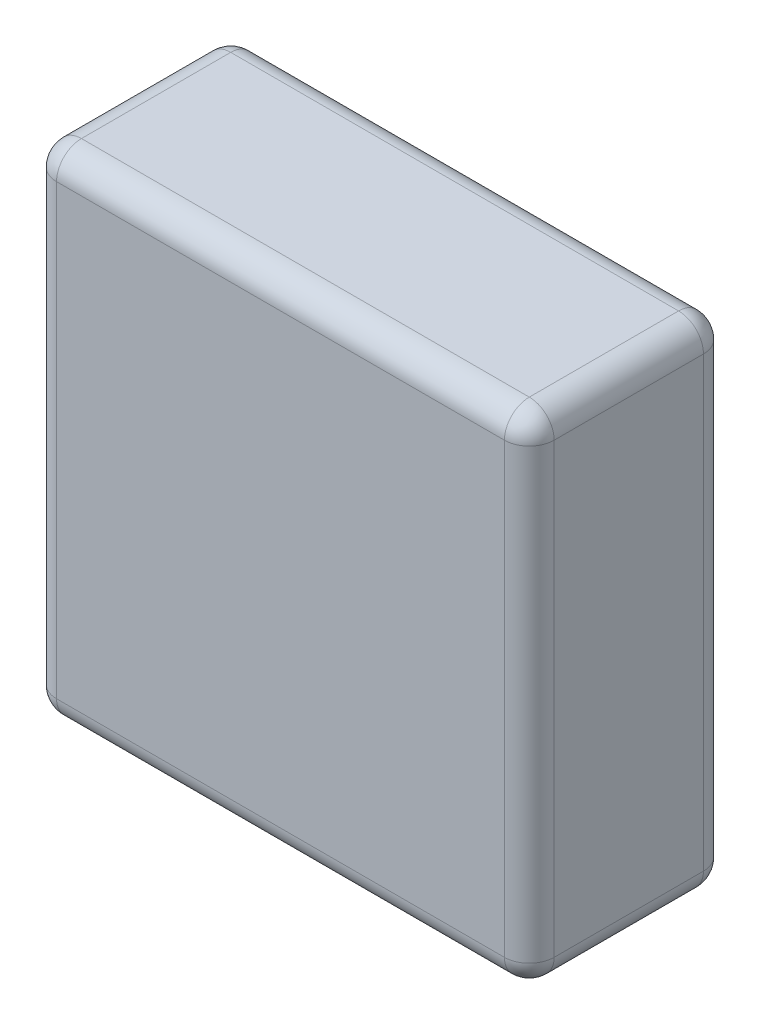
ISO-10303-21;
HEADER;
FILE_DESCRIPTION(('STEP AP214'),'2;1');
FILE_NAME('part.step','',(''),(''),'','','');
FILE_SCHEMA(('AUTOMOTIVE_DESIGN { 1 0 10303 214 1 1 1 1 }'));
ENDSEC;
DATA;
#1=APPLICATION_CONTEXT('core data for automotive mechanical design processes');
#2=APPLICATION_PROTOCOL_DEFINITION('international standard','automotive_design',2000,#1);
#3=PRODUCT_CONTEXT('',#1,'mechanical');
#4=PRODUCT('Part','Part','',(#3));
#5=PRODUCT_RELATED_PRODUCT_CATEGORY('part','',(#4));
#6=PRODUCT_DEFINITION_FORMATION('','',#4);
#7=PRODUCT_DEFINITION_CONTEXT('part definition',#1,'design');
#8=PRODUCT_DEFINITION('design','',#6,#7);
#9=PRODUCT_DEFINITION_SHAPE('','',#8);
#10=(LENGTH_UNIT() NAMED_UNIT(*) SI_UNIT(.MILLI.,.METRE.));
#11=(NAMED_UNIT(*) PLANE_ANGLE_UNIT() SI_UNIT($,.RADIAN.));
#12=(NAMED_UNIT(*) SI_UNIT($,.STERADIAN.) SOLID_ANGLE_UNIT());
#13=UNCERTAINTY_MEASURE_WITH_UNIT(LENGTH_MEASURE(1.E-05),#10,'distance_accuracy_value','');
#14=(GEOMETRIC_REPRESENTATION_CONTEXT(3) GLOBAL_UNCERTAINTY_ASSIGNED_CONTEXT((#13)) GLOBAL_UNIT_ASSIGNED_CONTEXT((#10,
#11,#12)) REPRESENTATION_CONTEXT('',''));
#15=CARTESIAN_POINT('',(0.,0.,0.));
#16=DIRECTION('',(0.,0.,1.));
#17=DIRECTION('',(1.,0.,0.));
#18=AXIS2_PLACEMENT_3D('',#15,#16,#17);
#19=CARTESIAN_POINT('',(0.,0.,4.));
#20=DIRECTION('',(1.,0.,0.));
#21=DIRECTION('',(0.,1.,0.));
#22=AXIS2_PLACEMENT_3D('',#19,#20,#21);
#23=PLANE('',#22);
#24=DIRECTION('',(0.,0.,-1.));
#25=VECTOR('',#24,1.);
#26=CARTESIAN_POINT('',(0.,-0.5,4.));
#27=LINE('',#26,#25);
#28=CARTESIAN_POINT('',(0.,-0.5,3.5));
#29=VERTEX_POINT('',#28);
#30=CARTESIAN_POINT('',(0.,-0.5,0.5));
#31=VERTEX_POINT('',#30);
#32=EDGE_CURVE('E131',#29,#31,#27,.T.);
#33=ORIENTED_EDGE('',*,*,#32,.T.);
#34=DIRECTION('',(0.,-1.,0.));
#35=VECTOR('',#34,1.);
#36=CARTESIAN_POINT('',(0.,0.,0.5));
#37=LINE('',#36,#35);
#38=CARTESIAN_POINT('',(0.,-9.5,0.5));
#39=VERTEX_POINT('',#38);
#40=EDGE_CURVE('E127',#31,#39,#37,.T.);
#41=ORIENTED_EDGE('',*,*,#40,.T.);
#42=DIRECTION('',(0.,0.,-1.));
#43=VECTOR('',#42,1.);
#44=CARTESIAN_POINT('',(0.,-9.5,4.));
#45=LINE('',#44,#43);
#46=CARTESIAN_POINT('',(0.,-9.5,3.5));
#47=VERTEX_POINT('',#46);
#48=EDGE_CURVE('E120',#39,#47,#45,.F.);
#49=ORIENTED_EDGE('',*,*,#48,.T.);
#50=DIRECTION('',(0.,-1.,0.));
#51=VECTOR('',#50,1.);
#52=CARTESIAN_POINT('',(0.,0.,3.5));
#53=LINE('',#52,#51);
#54=EDGE_CURVE('E124',#47,#29,#53,.F.);
#55=ORIENTED_EDGE('',*,*,#54,.T.);
#56=EDGE_LOOP('',(#33,#41,#49,#55));
#57=FACE_BOUND('',#56,.T.);
#58=ADVANCED_FACE('F32',(#57),#23,.F.);
#59=CARTESIAN_POINT('',(0.,-10.,4.));
#60=DIRECTION('',(0.,1.,0.));
#61=DIRECTION('',(0.,0.,1.));
#62=AXIS2_PLACEMENT_3D('',#59,#60,#61);
#63=PLANE('',#62);
#64=DIRECTION('',(0.,0.,-1.));
#65=VECTOR('',#64,1.);
#66=CARTESIAN_POINT('',(0.500000000000001,-10.,4.));
#67=LINE('',#66,#65);
#68=CARTESIAN_POINT('',(0.500000000000001,-10.,3.5));
#69=VERTEX_POINT('',#68);
#70=CARTESIAN_POINT('',(0.500000000000001,-10.,0.5));
#71=VERTEX_POINT('',#70);
#72=EDGE_CURVE('E139',#69,#71,#67,.T.);
#73=ORIENTED_EDGE('',*,*,#72,.T.);
#74=DIRECTION('',(1.,0.,0.));
#75=VECTOR('',#74,1.);
#76=CARTESIAN_POINT('',(0.,-10.,0.5));
#77=LINE('',#76,#75);
#78=CARTESIAN_POINT('',(9.5,-10.,0.5));
#79=VERTEX_POINT('',#78);
#80=EDGE_CURVE('E177',#71,#79,#77,.T.);
#81=ORIENTED_EDGE('',*,*,#80,.T.);
#82=DIRECTION('',(0.,0.,-1.));
#83=VECTOR('',#82,1.);
#84=CARTESIAN_POINT('',(9.5,-10.,4.));
#85=LINE('',#84,#83);
#86=CARTESIAN_POINT('',(9.5,-10.,3.5));
#87=VERTEX_POINT('',#86);
#88=EDGE_CURVE('E174',#79,#87,#85,.F.);
#89=ORIENTED_EDGE('',*,*,#88,.T.);
#90=DIRECTION('',(1.,0.,0.));
#91=VECTOR('',#90,1.);
#92=CARTESIAN_POINT('',(0.,-10.,3.5));
#93=LINE('',#92,#91);
#94=EDGE_CURVE('E172',#87,#69,#93,.F.);
#95=ORIENTED_EDGE('',*,*,#94,.T.);
#96=EDGE_LOOP('',(#73,#81,#89,#95));
#97=FACE_BOUND('',#96,.T.);
#98=ADVANCED_FACE('F294',(#97),#63,.F.);
#99=CARTESIAN_POINT('',(10.,0.,4.));
#100=DIRECTION('',(-1.,0.,0.));
#101=DIRECTION('',(0.,-1.,0.));
#102=AXIS2_PLACEMENT_3D('',#99,#100,#101);
#103=PLANE('',#102);
#104=DIRECTION('',(0.,0.,-1.));
#105=VECTOR('',#104,1.);
#106=CARTESIAN_POINT('',(10.,-9.5,4.));
#107=LINE('',#106,#105);
#108=CARTESIAN_POINT('',(10.,-9.5,3.5));
#109=VERTEX_POINT('',#108);
#110=CARTESIAN_POINT('',(10.,-9.5,0.5));
#111=VERTEX_POINT('',#110);
#112=EDGE_CURVE('E183',#109,#111,#107,.T.);
#113=ORIENTED_EDGE('',*,*,#112,.T.);
#114=DIRECTION('',(0.,1.,0.));
#115=VECTOR('',#114,1.);
#116=CARTESIAN_POINT('',(10.,0.,0.5));
#117=LINE('',#116,#115);
#118=CARTESIAN_POINT('',(10.,-0.5,0.5));
#119=VERTEX_POINT('',#118);
#120=EDGE_CURVE('E186',#111,#119,#117,.T.);
#121=ORIENTED_EDGE('',*,*,#120,.T.);
#122=DIRECTION('',(0.,0.,-1.));
#123=VECTOR('',#122,1.);
#124=CARTESIAN_POINT('',(10.,-0.5,4.));
#125=LINE('',#124,#123);
#126=CARTESIAN_POINT('',(10.,-0.5,3.5));
#127=VERTEX_POINT('',#126);
#128=EDGE_CURVE('E181',#119,#127,#125,.F.);
#129=ORIENTED_EDGE('',*,*,#128,.T.);
#130=DIRECTION('',(0.,1.,0.));
#131=VECTOR('',#130,1.);
#132=CARTESIAN_POINT('',(10.,-10.,3.5));
#133=LINE('',#132,#131);
#134=EDGE_CURVE('E179',#127,#109,#133,.F.);
#135=ORIENTED_EDGE('',*,*,#134,.T.);
#136=EDGE_LOOP('',(#113,#121,#129,#135));
#137=FACE_BOUND('',#136,.T.);
#138=ADVANCED_FACE('F271',(#137),#103,.F.);
#139=CARTESIAN_POINT('',(0.,0.,4.));
#140=DIRECTION('',(0.,-1.,0.));
#141=DIRECTION('',(0.,0.,-1.));
#142=AXIS2_PLACEMENT_3D('',#139,#140,#141);
#143=PLANE('',#142);
#144=DIRECTION('',(0.,0.,-1.));
#145=VECTOR('',#144,1.);
#146=CARTESIAN_POINT('',(9.5,0.,4.));
#147=LINE('',#146,#145);
#148=CARTESIAN_POINT('',(9.5,0.,3.5));
#149=VERTEX_POINT('',#148);
#150=CARTESIAN_POINT('',(9.5,0.,0.5));
#151=VERTEX_POINT('',#150);
#152=EDGE_CURVE('E165',#149,#151,#147,.T.);
#153=ORIENTED_EDGE('',*,*,#152,.T.);
#154=DIRECTION('',(-1.,0.,0.));
#155=VECTOR('',#154,1.);
#156=CARTESIAN_POINT('',(0.,0.,0.5));
#157=LINE('',#156,#155);
#158=CARTESIAN_POINT('',(0.5,0.,0.5));
#159=VERTEX_POINT('',#158);
#160=EDGE_CURVE('E170',#151,#159,#157,.T.);
#161=ORIENTED_EDGE('',*,*,#160,.T.);
#162=DIRECTION('',(0.,0.,-1.));
#163=VECTOR('',#162,1.);
#164=CARTESIAN_POINT('',(0.5,0.,4.));
#165=LINE('',#164,#163);
#166=CARTESIAN_POINT('',(0.5,0.,3.5));
#167=VERTEX_POINT('',#166);
#168=EDGE_CURVE('E167',#159,#167,#165,.F.);
#169=ORIENTED_EDGE('',*,*,#168,.T.);
#170=DIRECTION('',(-1.,0.,0.));
#171=VECTOR('',#170,1.);
#172=CARTESIAN_POINT('',(10.,0.,3.5));
#173=LINE('',#172,#171);
#174=EDGE_CURVE('E163',#167,#149,#173,.F.);
#175=ORIENTED_EDGE('',*,*,#174,.T.);
#176=EDGE_LOOP('',(#153,#161,#169,#175));
#177=FACE_BOUND('',#176,.T.);
#178=ADVANCED_FACE('F301',(#177),#143,.F.);
#179=CARTESIAN_POINT('',(0.,0.,4.));
#180=DIRECTION('',(0.,0.,1.));
#181=DIRECTION('',(1.,0.,0.));
#182=AXIS2_PLACEMENT_3D('',#179,#180,#181);
#183=PLANE('',#182);
#184=DIRECTION('',(0.,1.,0.));
#185=VECTOR('',#184,1.);
#186=CARTESIAN_POINT('',(9.5,0.,4.));
#187=LINE('',#186,#185);
#188=CARTESIAN_POINT('',(9.5,-9.5,4.));
#189=VERTEX_POINT('',#188);
#190=CARTESIAN_POINT('',(9.5,-0.5,4.));
#191=VERTEX_POINT('',#190);
#192=EDGE_CURVE('E41',#189,#191,#187,.T.);
#193=ORIENTED_EDGE('',*,*,#192,.T.);
#194=DIRECTION('',(-1.,0.,0.));
#195=VECTOR('',#194,1.);
#196=CARTESIAN_POINT('',(0.,-0.5,4.));
#197=LINE('',#196,#195);
#198=CARTESIAN_POINT('',(0.5,-0.5,4.));
#199=VERTEX_POINT('',#198);
#200=EDGE_CURVE('E11',#191,#199,#197,.T.);
#201=ORIENTED_EDGE('',*,*,#200,.T.);
#202=DIRECTION('',(0.,-1.,0.));
#203=VECTOR('',#202,1.);
#204=CARTESIAN_POINT('',(0.500000000000001,-10.,4.));
#205=LINE('',#204,#203);
#206=CARTESIAN_POINT('',(0.500000000000001,-9.5,4.));
#207=VERTEX_POINT('',#206);
#208=EDGE_CURVE('E197',#199,#207,#205,.T.);
#209=ORIENTED_EDGE('',*,*,#208,.T.);
#210=DIRECTION('',(1.,0.,0.));
#211=VECTOR('',#210,1.);
#212=CARTESIAN_POINT('',(10.,-9.5,4.));
#213=LINE('',#212,#211);
#214=EDGE_CURVE('E52',#207,#189,#213,.T.);
#215=ORIENTED_EDGE('',*,*,#214,.T.);
#216=EDGE_LOOP('',(#193,#201,#209,#215));
#217=FACE_BOUND('',#216,.T.);
#218=ADVANCED_FACE('F364',(#217),#183,.T.);
#219=CARTESIAN_POINT('',(0.,0.,0.));
#220=DIRECTION('',(0.,0.,1.));
#221=DIRECTION('',(1.,0.,0.));
#222=AXIS2_PLACEMENT_3D('',#219,#220,#221);
#223=PLANE('',#222);
#224=DIRECTION('',(0.,1.,0.));
#225=VECTOR('',#224,1.);
#226=CARTESIAN_POINT('',(9.5,0.,0.));
#227=LINE('',#226,#225);
#228=CARTESIAN_POINT('',(9.5,-0.5,0.));
#229=VERTEX_POINT('',#228);
#230=CARTESIAN_POINT('',(9.5,-9.5,0.));
#231=VERTEX_POINT('',#230);
#232=EDGE_CURVE('E192',#229,#231,#227,.F.);
#233=ORIENTED_EDGE('',*,*,#232,.T.);
#234=DIRECTION('',(1.,0.,0.));
#235=VECTOR('',#234,1.);
#236=CARTESIAN_POINT('',(0.,-9.5,0.));
#237=LINE('',#236,#235);
#238=CARTESIAN_POINT('',(0.500000000000001,-9.5,0.));
#239=VERTEX_POINT('',#238);
#240=EDGE_CURVE('E194',#231,#239,#237,.F.);
#241=ORIENTED_EDGE('',*,*,#240,.T.);
#242=DIRECTION('',(0.,-1.,0.));
#243=VECTOR('',#242,1.);
#244=CARTESIAN_POINT('',(0.5,0.,0.));
#245=LINE('',#244,#243);
#246=CARTESIAN_POINT('',(0.5,-0.5,0.));
#247=VERTEX_POINT('',#246);
#248=EDGE_CURVE('E188',#239,#247,#245,.F.);
#249=ORIENTED_EDGE('',*,*,#248,.T.);
#250=DIRECTION('',(-1.,0.,0.));
#251=VECTOR('',#250,1.);
#252=CARTESIAN_POINT('',(0.,-0.5,0.));
#253=LINE('',#252,#251);
#254=EDGE_CURVE('E190',#247,#229,#253,.F.);
#255=ORIENTED_EDGE('',*,*,#254,.T.);
#256=EDGE_LOOP('',(#233,#241,#249,#255));
#257=FACE_BOUND('',#256,.T.);
#258=ADVANCED_FACE('F263',(#257),#223,.F.);
#259=CARTESIAN_POINT('',(9.5,-9.5,4.));
#260=DIRECTION('',(0.,0.,-1.));
#261=DIRECTION('',(-1.,0.,0.));
#262=AXIS2_PLACEMENT_3D('',#259,#260,#261);
#263=CYLINDRICAL_SURFACE('',#262,0.5);
#264=CARTESIAN_POINT('',(9.5,-9.5,3.5));
#265=DIRECTION('',(0.,0.,1.));
#266=DIRECTION('',(1.,0.,0.));
#267=AXIS2_PLACEMENT_3D('',#264,#265,#266);
#268=CIRCLE('',#267,0.5);
#269=EDGE_CURVE('E36',#87,#109,#268,.T.);
#270=ORIENTED_EDGE('',*,*,#269,.F.);
#271=ORIENTED_EDGE('',*,*,#88,.F.);
#272=CARTESIAN_POINT('',(9.5,-9.5,0.5));
#273=DIRECTION('',(0.,0.,-1.));
#274=DIRECTION('',(-1.,0.,0.));
#275=AXIS2_PLACEMENT_3D('',#272,#273,#274);
#276=CIRCLE('',#275,0.5);
#277=EDGE_CURVE('E159',#111,#79,#276,.T.);
#278=ORIENTED_EDGE('',*,*,#277,.F.);
#279=ORIENTED_EDGE('',*,*,#112,.F.);
#280=EDGE_LOOP('',(#270,#271,#278,#279));
#281=FACE_BOUND('',#280,.T.);
#282=ADVANCED_FACE('F34',(#281),#263,.T.);
#283=CARTESIAN_POINT('',(9.5,-9.5,3.5));
#284=DIRECTION('',(0.,0.,1.));
#285=DIRECTION('',(1.,0.,0.));
#286=AXIS2_PLACEMENT_3D('',#283,#284,#285);
#287=SPHERICAL_SURFACE('',#286,0.5);
#288=CARTESIAN_POINT('',(9.5,-9.5,3.5));
#289=DIRECTION('',(1.,0.,0.));
#290=DIRECTION('',(0.,0.,-1.));
#291=AXIS2_PLACEMENT_3D('',#288,#289,#290);
#292=CIRCLE('',#291,0.5);
#293=EDGE_CURVE('E244',#87,#189,#292,.F.);
#294=ORIENTED_EDGE('',*,*,#293,.F.);
#295=ORIENTED_EDGE('',*,*,#269,.T.);
#296=CARTESIAN_POINT('',(9.5,-9.5,3.5));
#297=DIRECTION('',(0.,-1.,0.));
#298=DIRECTION('',(0.,0.,-1.));
#299=AXIS2_PLACEMENT_3D('',#296,#297,#298);
#300=CIRCLE('',#299,0.5);
#301=EDGE_CURVE('E246',#189,#109,#300,.F.);
#302=ORIENTED_EDGE('',*,*,#301,.F.);
#303=EDGE_LOOP('',(#294,#295,#302));
#304=FACE_BOUND('',#303,.T.);
#305=ADVANCED_FACE('F289',(#304),#287,.T.);
#306=CARTESIAN_POINT('',(9.5,-9.5,0.5));
#307=DIRECTION('',(0.,0.,1.));
#308=DIRECTION('',(1.,0.,0.));
#309=AXIS2_PLACEMENT_3D('',#306,#307,#308);
#310=SPHERICAL_SURFACE('',#309,0.5);
#311=CARTESIAN_POINT('',(9.5,-9.5,0.5));
#312=DIRECTION('',(0.,-1.,0.));
#313=DIRECTION('',(0.,0.,-1.));
#314=AXIS2_PLACEMENT_3D('',#311,#312,#313);
#315=CIRCLE('',#314,0.5);
#316=EDGE_CURVE('E238',#111,#231,#315,.F.);
#317=ORIENTED_EDGE('',*,*,#316,.F.);
#318=ORIENTED_EDGE('',*,*,#277,.T.);
#319=CARTESIAN_POINT('',(9.5,-9.5,0.5));
#320=DIRECTION('',(1.,0.,0.));
#321=DIRECTION('',(0.,0.,-1.));
#322=AXIS2_PLACEMENT_3D('',#319,#320,#321);
#323=CIRCLE('',#322,0.5);
#324=EDGE_CURVE('E241',#231,#79,#323,.F.);
#325=ORIENTED_EDGE('',*,*,#324,.F.);
#326=EDGE_LOOP('',(#317,#318,#325));
#327=FACE_BOUND('',#326,.T.);
#328=ADVANCED_FACE('F253',(#327),#310,.T.);
#329=CARTESIAN_POINT('',(9.5,0.,3.5));
#330=DIRECTION('',(0.,-1.,0.));
#331=DIRECTION('',(1.,0.,0.));
#332=AXIS2_PLACEMENT_3D('',#329,#330,#331);
#333=CYLINDRICAL_SURFACE('',#332,0.5);
#334=ORIENTED_EDGE('',*,*,#301,.T.);
#335=ORIENTED_EDGE('',*,*,#134,.F.);
#336=CARTESIAN_POINT('',(9.5,-0.5,3.5));
#337=DIRECTION('',(0.,1.,0.));
#338=DIRECTION('',(-1.,0.,0.));
#339=AXIS2_PLACEMENT_3D('',#336,#337,#338);
#340=CIRCLE('',#339,0.5);
#341=EDGE_CURVE('E232',#191,#127,#340,.T.);
#342=ORIENTED_EDGE('',*,*,#341,.F.);
#343=ORIENTED_EDGE('',*,*,#192,.F.);
#344=EDGE_LOOP('',(#334,#335,#342,#343));
#345=FACE_BOUND('',#344,.T.);
#346=ADVANCED_FACE('F284',(#345),#333,.T.);
#347=CARTESIAN_POINT('',(0.,-9.5,3.5));
#348=DIRECTION('',(-1.,0.,0.));
#349=DIRECTION('',(0.,0.,1.));
#350=AXIS2_PLACEMENT_3D('',#347,#348,#349);
#351=CYLINDRICAL_SURFACE('',#350,0.5);
#352=ORIENTED_EDGE('',*,*,#293,.T.);
#353=ORIENTED_EDGE('',*,*,#214,.F.);
#354=CARTESIAN_POINT('',(0.500000000000001,-9.5,3.5));
#355=DIRECTION('',(-1.,0.,0.));
#356=DIRECTION('',(0.,0.,1.));
#357=AXIS2_PLACEMENT_3D('',#354,#355,#356);
#358=CIRCLE('',#357,0.5);
#359=EDGE_CURVE('E143',#69,#207,#358,.T.);
#360=ORIENTED_EDGE('',*,*,#359,.F.);
#361=ORIENTED_EDGE('',*,*,#94,.F.);
#362=EDGE_LOOP('',(#352,#353,#360,#361));
#363=FACE_BOUND('',#362,.T.);
#364=ADVANCED_FACE('F292',(#363),#351,.T.);
#365=CARTESIAN_POINT('',(0.500000000000001,-9.5,4.));
#366=DIRECTION('',(0.,0.,-1.));
#367=DIRECTION('',(-1.,0.,0.));
#368=AXIS2_PLACEMENT_3D('',#365,#366,#367);
#369=CYLINDRICAL_SURFACE('',#368,0.5);
#370=CARTESIAN_POINT('',(0.500000000000001,-9.5,0.5));
#371=DIRECTION('',(0.,0.,-1.));
#372=DIRECTION('',(-1.,0.,0.));
#373=AXIS2_PLACEMENT_3D('',#370,#371,#372);
#374=CIRCLE('',#373,0.5);
#375=EDGE_CURVE('E144',#71,#39,#374,.T.);
#376=ORIENTED_EDGE('',*,*,#375,.F.);
#377=ORIENTED_EDGE('',*,*,#72,.F.);
#378=CARTESIAN_POINT('',(0.500000000000001,-9.5,3.5));
#379=DIRECTION('',(0.,0.,1.));
#380=DIRECTION('',(1.,0.,0.));
#381=AXIS2_PLACEMENT_3D('',#378,#379,#380);
#382=CIRCLE('',#381,0.5);
#383=EDGE_CURVE('E135',#47,#69,#382,.T.);
#384=ORIENTED_EDGE('',*,*,#383,.F.);
#385=ORIENTED_EDGE('',*,*,#48,.F.);
#386=EDGE_LOOP('',(#376,#377,#384,#385));
#387=FACE_BOUND('',#386,.T.);
#388=ADVANCED_FACE('F137',(#387),#369,.T.);
#389=CARTESIAN_POINT('',(0.,-9.5,0.5));
#390=DIRECTION('',(1.,0.,0.));
#391=DIRECTION('',(0.,0.,-1.));
#392=AXIS2_PLACEMENT_3D('',#389,#390,#391);
#393=CYLINDRICAL_SURFACE('',#392,0.5);
#394=ORIENTED_EDGE('',*,*,#324,.T.);
#395=ORIENTED_EDGE('',*,*,#80,.F.);
#396=CARTESIAN_POINT('',(0.500000000000001,-9.5,0.5));
#397=DIRECTION('',(-1.,0.,0.));
#398=DIRECTION('',(0.,0.,1.));
#399=AXIS2_PLACEMENT_3D('',#396,#397,#398);
#400=CIRCLE('',#399,0.5);
#401=EDGE_CURVE('E228',#239,#71,#400,.T.);
#402=ORIENTED_EDGE('',*,*,#401,.F.);
#403=ORIENTED_EDGE('',*,*,#240,.F.);
#404=EDGE_LOOP('',(#394,#395,#402,#403));
#405=FACE_BOUND('',#404,.T.);
#406=ADVANCED_FACE('F260',(#405),#393,.T.);
#407=CARTESIAN_POINT('',(9.5,0.,0.5));
#408=DIRECTION('',(0.,1.,0.));
#409=DIRECTION('',(-1.,0.,0.));
#410=AXIS2_PLACEMENT_3D('',#407,#408,#409);
#411=CYLINDRICAL_SURFACE('',#410,0.5);
#412=ORIENTED_EDGE('',*,*,#316,.T.);
#413=ORIENTED_EDGE('',*,*,#232,.F.);
#414=CARTESIAN_POINT('',(9.5,-0.5,0.5));
#415=DIRECTION('',(0.,1.,0.));
#416=DIRECTION('',(-1.,0.,0.));
#417=AXIS2_PLACEMENT_3D('',#414,#415,#416);
#418=CIRCLE('',#417,0.5);
#419=EDGE_CURVE('E225',#119,#229,#418,.T.);
#420=ORIENTED_EDGE('',*,*,#419,.F.);
#421=ORIENTED_EDGE('',*,*,#120,.F.);
#422=EDGE_LOOP('',(#412,#413,#420,#421));
#423=FACE_BOUND('',#422,.T.);
#424=ADVANCED_FACE('F268',(#423),#411,.T.);
#425=CARTESIAN_POINT('',(9.5,-0.5,4.));
#426=DIRECTION('',(0.,0.,-1.));
#427=DIRECTION('',(-1.,0.,0.));
#428=AXIS2_PLACEMENT_3D('',#425,#426,#427);
#429=CYLINDRICAL_SURFACE('',#428,0.5);
#430=CARTESIAN_POINT('',(9.5,-0.5,3.5));
#431=DIRECTION('',(0.,0.,1.));
#432=DIRECTION('',(1.,0.,0.));
#433=AXIS2_PLACEMENT_3D('',#430,#431,#432);
#434=CIRCLE('',#433,0.5);
#435=EDGE_CURVE('E235',#127,#149,#434,.T.);
#436=ORIENTED_EDGE('',*,*,#435,.F.);
#437=ORIENTED_EDGE('',*,*,#128,.F.);
#438=CARTESIAN_POINT('',(9.5,-0.5,0.5));
#439=DIRECTION('',(0.,0.,-1.));
#440=DIRECTION('',(-1.,0.,0.));
#441=AXIS2_PLACEMENT_3D('',#438,#439,#440);
#442=CIRCLE('',#441,0.5);
#443=EDGE_CURVE('E222',#151,#119,#442,.T.);
#444=ORIENTED_EDGE('',*,*,#443,.F.);
#445=ORIENTED_EDGE('',*,*,#152,.F.);
#446=EDGE_LOOP('',(#436,#437,#444,#445));
#447=FACE_BOUND('',#446,.T.);
#448=ADVANCED_FACE('F276',(#447),#429,.T.);
#449=CARTESIAN_POINT('',(9.5,-0.5,3.5));
#450=DIRECTION('',(0.,0.,1.));
#451=DIRECTION('',(1.,0.,0.));
#452=AXIS2_PLACEMENT_3D('',#449,#450,#451);
#453=SPHERICAL_SURFACE('',#452,0.5);
#454=ORIENTED_EDGE('',*,*,#341,.T.);
#455=ORIENTED_EDGE('',*,*,#435,.T.);
#456=CARTESIAN_POINT('',(9.5,-0.5,3.5));
#457=DIRECTION('',(1.,0.,0.));
#458=DIRECTION('',(0.,0.,-1.));
#459=AXIS2_PLACEMENT_3D('',#456,#457,#458);
#460=CIRCLE('',#459,0.5);
#461=EDGE_CURVE('E151',#191,#149,#460,.F.);
#462=ORIENTED_EDGE('',*,*,#461,.F.);
#463=EDGE_LOOP('',(#454,#455,#462));
#464=FACE_BOUND('',#463,.T.);
#465=ADVANCED_FACE('F281',(#464),#453,.T.);
#466=CARTESIAN_POINT('',(0.500000000000001,-9.5,3.5));
#467=DIRECTION('',(0.,0.,1.));
#468=DIRECTION('',(1.,0.,0.));
#469=AXIS2_PLACEMENT_3D('',#466,#467,#468);
#470=SPHERICAL_SURFACE('',#469,0.5);
#471=ORIENTED_EDGE('',*,*,#383,.T.);
#472=ORIENTED_EDGE('',*,*,#359,.T.);
#473=CARTESIAN_POINT('',(0.500000000000001,-9.5,3.5));
#474=DIRECTION('',(0.,-1.,0.));
#475=DIRECTION('',(0.,0.,-1.));
#476=AXIS2_PLACEMENT_3D('',#473,#474,#475);
#477=CIRCLE('',#476,0.5);
#478=EDGE_CURVE('E147',#47,#207,#477,.F.);
#479=ORIENTED_EDGE('',*,*,#478,.F.);
#480=EDGE_LOOP('',(#471,#472,#479));
#481=FACE_BOUND('',#480,.T.);
#482=ADVANCED_FACE('F148',(#481),#470,.T.);
#483=CARTESIAN_POINT('',(0.500000000000001,-9.5,0.5));
#484=DIRECTION('',(0.,0.,1.));
#485=DIRECTION('',(1.,0.,0.));
#486=AXIS2_PLACEMENT_3D('',#483,#484,#485);
#487=SPHERICAL_SURFACE('',#486,0.5);
#488=ORIENTED_EDGE('',*,*,#401,.T.);
#489=ORIENTED_EDGE('',*,*,#375,.T.);
#490=CARTESIAN_POINT('',(0.500000000000001,-9.5,0.5));
#491=DIRECTION('',(0.,-1.,0.));
#492=DIRECTION('',(0.,0.,-1.));
#493=AXIS2_PLACEMENT_3D('',#490,#491,#492);
#494=CIRCLE('',#493,0.5);
#495=EDGE_CURVE('E152',#239,#39,#494,.F.);
#496=ORIENTED_EDGE('',*,*,#495,.F.);
#497=EDGE_LOOP('',(#488,#489,#496));
#498=FACE_BOUND('',#497,.T.);
#499=ADVANCED_FACE('F335',(#498),#487,.T.);
#500=CARTESIAN_POINT('',(9.5,-0.5,0.5));
#501=DIRECTION('',(0.,0.,1.));
#502=DIRECTION('',(1.,0.,0.));
#503=AXIS2_PLACEMENT_3D('',#500,#501,#502);
#504=SPHERICAL_SURFACE('',#503,0.5);
#505=ORIENTED_EDGE('',*,*,#443,.T.);
#506=ORIENTED_EDGE('',*,*,#419,.T.);
#507=CARTESIAN_POINT('',(9.5,-0.5,0.5));
#508=DIRECTION('',(1.,0.,0.));
#509=DIRECTION('',(0.,0.,-1.));
#510=AXIS2_PLACEMENT_3D('',#507,#508,#509);
#511=CIRCLE('',#510,0.5);
#512=EDGE_CURVE('E215',#151,#229,#511,.F.);
#513=ORIENTED_EDGE('',*,*,#512,.F.);
#514=EDGE_LOOP('',(#505,#506,#513));
#515=FACE_BOUND('',#514,.T.);
#516=ADVANCED_FACE('F331',(#515),#504,.T.);
#517=CARTESIAN_POINT('',(0.,-0.5,3.5));
#518=DIRECTION('',(1.,0.,0.));
#519=DIRECTION('',(0.,0.,-1.));
#520=AXIS2_PLACEMENT_3D('',#517,#518,#519);
#521=CYLINDRICAL_SURFACE('',#520,0.5);
#522=ORIENTED_EDGE('',*,*,#461,.T.);
#523=ORIENTED_EDGE('',*,*,#174,.F.);
#524=CARTESIAN_POINT('',(0.5,-0.5,3.5));
#525=DIRECTION('',(-1.,0.,0.));
#526=DIRECTION('',(0.,-1.,0.));
#527=AXIS2_PLACEMENT_3D('',#524,#525,#526);
#528=CIRCLE('',#527,0.5);
#529=EDGE_CURVE('E212',#199,#167,#528,.T.);
#530=ORIENTED_EDGE('',*,*,#529,.F.);
#531=ORIENTED_EDGE('',*,*,#200,.F.);
#532=EDGE_LOOP('',(#522,#523,#530,#531));
#533=FACE_BOUND('',#532,.T.);
#534=ADVANCED_FACE('F328',(#533),#521,.T.);
#535=CARTESIAN_POINT('',(0.5,0.,3.5));
#536=DIRECTION('',(0.,1.,0.));
#537=DIRECTION('',(-1.,0.,0.));
#538=AXIS2_PLACEMENT_3D('',#535,#536,#537);
#539=CYLINDRICAL_SURFACE('',#538,0.5);
#540=ORIENTED_EDGE('',*,*,#478,.T.);
#541=ORIENTED_EDGE('',*,*,#208,.F.);
#542=CARTESIAN_POINT('',(0.5,-0.5,3.5));
#543=DIRECTION('',(0.,1.,0.));
#544=DIRECTION('',(-1.,0.,0.));
#545=AXIS2_PLACEMENT_3D('',#542,#543,#544);
#546=CIRCLE('',#545,0.5);
#547=EDGE_CURVE('E155',#29,#199,#546,.T.);
#548=ORIENTED_EDGE('',*,*,#547,.F.);
#549=ORIENTED_EDGE('',*,*,#54,.F.);
#550=EDGE_LOOP('',(#540,#541,#548,#549));
#551=FACE_BOUND('',#550,.T.);
#552=ADVANCED_FACE('F154',(#551),#539,.T.);
#553=CARTESIAN_POINT('',(0.5,0.,0.5));
#554=DIRECTION('',(0.,-1.,0.));
#555=DIRECTION('',(1.,0.,0.));
#556=AXIS2_PLACEMENT_3D('',#553,#554,#555);
#557=CYLINDRICAL_SURFACE('',#556,0.5);
#558=ORIENTED_EDGE('',*,*,#495,.T.);
#559=ORIENTED_EDGE('',*,*,#40,.F.);
#560=CARTESIAN_POINT('',(0.5,-0.5,0.5));
#561=DIRECTION('',(0.,1.,0.));
#562=DIRECTION('',(-1.,0.,0.));
#563=AXIS2_PLACEMENT_3D('',#560,#561,#562);
#564=CIRCLE('',#563,0.5);
#565=EDGE_CURVE('E208',#247,#31,#564,.T.);
#566=ORIENTED_EDGE('',*,*,#565,.F.);
#567=ORIENTED_EDGE('',*,*,#248,.F.);
#568=EDGE_LOOP('',(#558,#559,#566,#567));
#569=FACE_BOUND('',#568,.T.);
#570=ADVANCED_FACE('F321',(#569),#557,.T.);
#571=CARTESIAN_POINT('',(0.,-0.5,0.5));
#572=DIRECTION('',(-1.,0.,0.));
#573=DIRECTION('',(0.,0.,1.));
#574=AXIS2_PLACEMENT_3D('',#571,#572,#573);
#575=CYLINDRICAL_SURFACE('',#574,0.5);
#576=ORIENTED_EDGE('',*,*,#512,.T.);
#577=ORIENTED_EDGE('',*,*,#254,.F.);
#578=CARTESIAN_POINT('',(0.5,-0.5,0.5));
#579=DIRECTION('',(-1.,0.,0.));
#580=DIRECTION('',(0.,0.,1.));
#581=AXIS2_PLACEMENT_3D('',#578,#579,#580);
#582=CIRCLE('',#581,0.5);
#583=EDGE_CURVE('E205',#159,#247,#582,.T.);
#584=ORIENTED_EDGE('',*,*,#583,.F.);
#585=ORIENTED_EDGE('',*,*,#160,.F.);
#586=EDGE_LOOP('',(#576,#577,#584,#585));
#587=FACE_BOUND('',#586,.T.);
#588=ADVANCED_FACE('F317',(#587),#575,.T.);
#589=CARTESIAN_POINT('',(0.5,-0.5,3.5));
#590=DIRECTION('',(0.,0.,1.));
#591=DIRECTION('',(1.,0.,0.));
#592=AXIS2_PLACEMENT_3D('',#589,#590,#591);
#593=SPHERICAL_SURFACE('',#592,0.5);
#594=ORIENTED_EDGE('',*,*,#547,.T.);
#595=ORIENTED_EDGE('',*,*,#529,.T.);
#596=CARTESIAN_POINT('',(0.5,-0.5,3.5));
#597=DIRECTION('',(0.,0.,1.));
#598=DIRECTION('',(1.,0.,0.));
#599=AXIS2_PLACEMENT_3D('',#596,#597,#598);
#600=CIRCLE('',#599,0.5);
#601=EDGE_CURVE('E203',#29,#167,#600,.F.);
#602=ORIENTED_EDGE('',*,*,#601,.F.);
#603=EDGE_LOOP('',(#594,#595,#602));
#604=FACE_BOUND('',#603,.T.);
#605=ADVANCED_FACE('F313',(#604),#593,.T.);
#606=CARTESIAN_POINT('',(0.5,-0.5,0.5));
#607=DIRECTION('',(0.,0.,1.));
#608=DIRECTION('',(1.,0.,0.));
#609=AXIS2_PLACEMENT_3D('',#606,#607,#608);
#610=SPHERICAL_SURFACE('',#609,0.5);
#611=ORIENTED_EDGE('',*,*,#583,.T.);
#612=ORIENTED_EDGE('',*,*,#565,.T.);
#613=CARTESIAN_POINT('',(0.5,-0.5,0.5));
#614=DIRECTION('',(0.,0.,-1.));
#615=DIRECTION('',(-1.,0.,0.));
#616=AXIS2_PLACEMENT_3D('',#613,#614,#615);
#617=CIRCLE('',#616,0.5);
#618=EDGE_CURVE('E201',#159,#31,#617,.F.);
#619=ORIENTED_EDGE('',*,*,#618,.F.);
#620=EDGE_LOOP('',(#611,#612,#619));
#621=FACE_BOUND('',#620,.T.);
#622=ADVANCED_FACE('F309',(#621),#610,.T.);
#623=CARTESIAN_POINT('',(0.5,-0.5,4.));
#624=DIRECTION('',(0.,0.,-1.));
#625=DIRECTION('',(-1.,0.,0.));
#626=AXIS2_PLACEMENT_3D('',#623,#624,#625);
#627=CYLINDRICAL_SURFACE('',#626,0.5);
#628=ORIENTED_EDGE('',*,*,#601,.T.);
#629=ORIENTED_EDGE('',*,*,#168,.F.);
#630=ORIENTED_EDGE('',*,*,#618,.T.);
#631=ORIENTED_EDGE('',*,*,#32,.F.);
#632=EDGE_LOOP('',(#628,#629,#630,#631));
#633=FACE_BOUND('',#632,.T.);
#634=ADVANCED_FACE('F306',(#633),#627,.T.);
#635=CLOSED_SHELL('',(#58,#98,#138,#178,#218,#258,#282,#305,#328,#346,#364,#388,#406,#424,#448,
#465,#482,#499,#516,#534,#552,#570,#588,#605,#622,#634));
#636=MANIFOLD_SOLID_BREP('B2',#635);
#637=ADVANCED_BREP_SHAPE_REPRESENTATION('',(#18,#636),#14);
#638=SHAPE_DEFINITION_REPRESENTATION(#9,#637);
ENDSEC;
END-ISO-10303-21;
